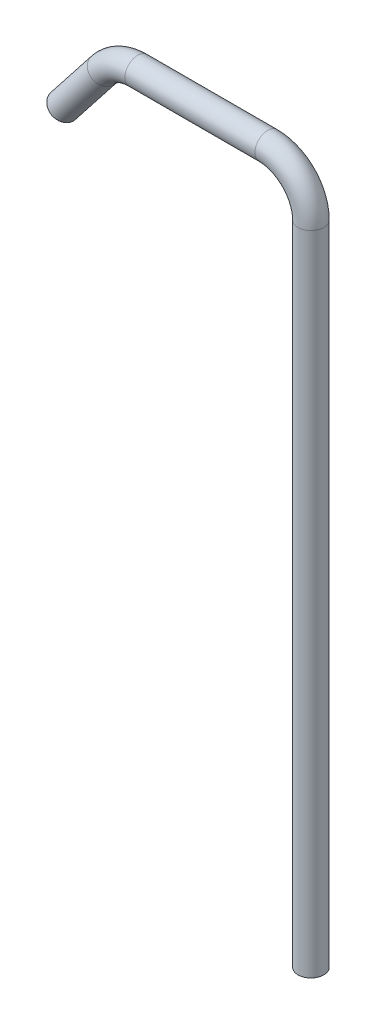
ISO-10303-21;
HEADER;
FILE_DESCRIPTION(('STEP AP214'),'2;1');
FILE_NAME('part.step','',(''),(''),'','','');
FILE_SCHEMA(('AUTOMOTIVE_DESIGN { 1 0 10303 214 1 1 1 1 }'));
ENDSEC;
DATA;
#1=APPLICATION_CONTEXT('core data for automotive mechanical design processes');
#2=APPLICATION_PROTOCOL_DEFINITION('international standard','automotive_design',2000,#1);
#3=PRODUCT_CONTEXT('',#1,'mechanical');
#4=PRODUCT('Part','Part','',(#3));
#5=PRODUCT_RELATED_PRODUCT_CATEGORY('part','',(#4));
#6=PRODUCT_DEFINITION_FORMATION('','',#4);
#7=PRODUCT_DEFINITION_CONTEXT('part definition',#1,'design');
#8=PRODUCT_DEFINITION('design','',#6,#7);
#9=PRODUCT_DEFINITION_SHAPE('','',#8);
#10=(LENGTH_UNIT() NAMED_UNIT(*) SI_UNIT(.MILLI.,.METRE.));
#11=(NAMED_UNIT(*) PLANE_ANGLE_UNIT() SI_UNIT($,.RADIAN.));
#12=(NAMED_UNIT(*) SI_UNIT($,.STERADIAN.) SOLID_ANGLE_UNIT());
#13=UNCERTAINTY_MEASURE_WITH_UNIT(LENGTH_MEASURE(1.E-05),#10,'distance_accuracy_value','');
#14=(GEOMETRIC_REPRESENTATION_CONTEXT(3) GLOBAL_UNCERTAINTY_ASSIGNED_CONTEXT((#13)) GLOBAL_UNIT_ASSIGNED_CONTEXT((#10,
#11,#12)) REPRESENTATION_CONTEXT('',''));
#15=CARTESIAN_POINT('',(0.,0.,0.));
#16=DIRECTION('',(0.,0.,1.));
#17=DIRECTION('',(1.,0.,0.));
#18=AXIS2_PLACEMENT_3D('',#15,#16,#17);
#19=CARTESIAN_POINT('',(-57.4055239128661,94.2016080561814,0.));
#20=DIRECTION('',(-0.617590719401513,-0.786499652453275,0.));
#21=DIRECTION('',(0.,0.,1.));
#22=AXIS2_PLACEMENT_3D('',#19,#20,#21);
#23=PLANE('',#22);
#24=CARTESIAN_POINT('',(-57.4055239128661,94.2016080561814,0.));
#25=DIRECTION('',(-0.617590719401513,-0.786499652453275,0.));
#26=DIRECTION('',(0.,0.,1.));
#27=AXIS2_PLACEMENT_3D('',#24,#25,#26);
#28=CIRCLE('',#27,3.);
#29=CARTESIAN_POINT('',(-57.4055239128661,94.2016080561814,3.));
#30=VERTEX_POINT('',#29);
#31=EDGE_CURVE('E11',#30,#30,#28,.T.);
#32=ORIENTED_EDGE('',*,*,#31,.T.);
#33=EDGE_LOOP('',(#32));
#34=FACE_BOUND('',#33,.T.);
#35=ADVANCED_FACE('F33',(#34),#23,.T.);
#36=CARTESIAN_POINT('',(0.,0.,0.));
#37=DIRECTION('',(0.,1.,0.));
#38=DIRECTION('',(0.,0.,1.));
#39=AXIS2_PLACEMENT_3D('',#36,#37,#38);
#40=CYLINDRICAL_SURFACE('',#39,3.);
#41=CARTESIAN_POINT('',(0.,99.9999999999999,0.));
#42=DIRECTION('',(0.,1.,0.));
#43=DIRECTION('',(0.,0.,1.));
#44=AXIS2_PLACEMENT_3D('',#41,#42,#43);
#45=CIRCLE('',#44,3.);
#46=CARTESIAN_POINT('',(3.,99.9999999999999,0.));
#47=VERTEX_POINT('',#46);
#48=EDGE_CURVE('E58',#47,#47,#45,.T.);
#49=ORIENTED_EDGE('',*,*,#48,.F.);
#50=EDGE_LOOP('',(#49));
#51=FACE_BOUND('',#50,.T.);
#52=CARTESIAN_POINT('',(0.,-50.,0.));
#53=DIRECTION('',(0.,-1.,0.));
#54=DIRECTION('',(0.,0.,-1.));
#55=AXIS2_PLACEMENT_3D('',#52,#53,#54);
#56=CIRCLE('',#55,3.);
#57=CARTESIAN_POINT('',(0.,-50.,-3.));
#58=VERTEX_POINT('',#57);
#59=EDGE_CURVE('E61',#58,#58,#56,.T.);
#60=ORIENTED_EDGE('',*,*,#59,.F.);
#61=EDGE_LOOP('',(#60));
#62=FACE_BOUND('',#61,.T.);
#63=ADVANCED_FACE('F66',(#51,#62),#40,.T.);
#64=CARTESIAN_POINT('',(-10.,100.,0.));
#65=DIRECTION('',(0.,0.,1.));
#66=DIRECTION('',(1.,0.,0.));
#67=AXIS2_PLACEMENT_3D('',#64,#65,#66);
#68=TOROIDAL_SURFACE('',#67,10.,3.);
#69=CARTESIAN_POINT('',(-10.0000000000001,110.,0.));
#70=DIRECTION('',(-1.,0.,0.));
#71=DIRECTION('',(0.,0.,1.));
#72=AXIS2_PLACEMENT_3D('',#69,#70,#71);
#73=CIRCLE('',#72,3.);
#74=CARTESIAN_POINT('',(-10.0000000000001,113.,0.));
#75=VERTEX_POINT('',#74);
#76=EDGE_CURVE('E53',#75,#75,#73,.T.);
#77=CARTESIAN_POINT('',(-10.,100.,0.));
#78=DIRECTION('',(0.,0.,1.));
#79=DIRECTION('',(1.,0.,0.));
#80=AXIS2_PLACEMENT_3D('',#77,#78,#79);
#81=CIRCLE('',#80,13.);
#82=EDGE_CURVE('',#47,#75,#81,.T.);
#83=ORIENTED_EDGE('',*,*,#48,.T.);
#84=ORIENTED_EDGE('',*,*,#76,.F.);
#85=ORIENTED_EDGE('',*,*,#82,.T.);
#86=ORIENTED_EDGE('',*,*,#82,.F.);
#87=EDGE_LOOP('',(#83,#85,#84,#86));
#88=FACE_BOUND('',#87,.T.);
#89=ADVANCED_FACE('F68',(#88),#68,.T.);
#90=CARTESIAN_POINT('',(-10.0000000000001,110.,0.));
#91=DIRECTION('',(-1.,0.,0.));
#92=DIRECTION('',(0.,0.,1.));
#93=AXIS2_PLACEMENT_3D('',#90,#91,#92);
#94=CYLINDRICAL_SURFACE('',#93,3.);
#95=CARTESIAN_POINT('',(-40.1378328088809,110.,0.));
#96=DIRECTION('',(-1.,0.,0.));
#97=DIRECTION('',(0.,0.,1.));
#98=AXIS2_PLACEMENT_3D('',#95,#96,#97);
#99=CIRCLE('',#98,3.);
#100=CARTESIAN_POINT('',(-40.1378328088809,113.,0.));
#101=VERTEX_POINT('',#100);
#102=EDGE_CURVE('E51',#101,#101,#99,.T.);
#103=ORIENTED_EDGE('',*,*,#102,.F.);
#104=EDGE_LOOP('',(#103));
#105=FACE_BOUND('',#104,.T.);
#106=ORIENTED_EDGE('',*,*,#76,.T.);
#107=EDGE_LOOP('',(#106));
#108=FACE_BOUND('',#107,.T.);
#109=ADVANCED_FACE('F75',(#105,#108),#94,.T.);
#110=CARTESIAN_POINT('',(-40.1378328088809,100.,0.));
#111=DIRECTION('',(0.,0.,1.));
#112=DIRECTION('',(1.,0.,0.));
#113=AXIS2_PLACEMENT_3D('',#110,#111,#112);
#114=TOROIDAL_SURFACE('',#113,9.99999999999999,3.);
#115=CARTESIAN_POINT('',(-48.0028293334137,106.175907194015,0.));
#116=DIRECTION('',(-0.617590719401509,-0.786499652453277,0.));
#117=DIRECTION('',(0.,0.,1.));
#118=AXIS2_PLACEMENT_3D('',#115,#116,#117);
#119=CIRCLE('',#118,3.);
#120=CARTESIAN_POINT('',(-50.3623282907735,108.02867935222,0.));
#121=VERTEX_POINT('',#120);
#122=EDGE_CURVE('E39',#121,#121,#119,.T.);
#123=CARTESIAN_POINT('',(-40.1378328088809,100.,0.));
#124=DIRECTION('',(0.,0.,1.));
#125=DIRECTION('',(1.,0.,0.));
#126=AXIS2_PLACEMENT_3D('',#123,#124,#125);
#127=CIRCLE('',#126,13.);
#128=EDGE_CURVE('',#101,#121,#127,.T.);
#129=ORIENTED_EDGE('',*,*,#102,.T.);
#130=ORIENTED_EDGE('',*,*,#122,.F.);
#131=ORIENTED_EDGE('',*,*,#128,.T.);
#132=ORIENTED_EDGE('',*,*,#128,.F.);
#133=EDGE_LOOP('',(#129,#131,#130,#132));
#134=FACE_BOUND('',#133,.T.);
#135=ADVANCED_FACE('F47',(#134),#114,.T.);
#136=CARTESIAN_POINT('',(-48.0028293334137,106.175907194015,0.));
#137=DIRECTION('',(-0.617590719401513,-0.786499652453275,0.));
#138=DIRECTION('',(0.786499652453275,-0.617590719401513,0.));
#139=AXIS2_PLACEMENT_3D('',#136,#137,#138);
#140=CYLINDRICAL_SURFACE('',#139,3.);
#141=ORIENTED_EDGE('',*,*,#31,.F.);
#142=EDGE_LOOP('',(#141));
#143=FACE_BOUND('',#142,.T.);
#144=ORIENTED_EDGE('',*,*,#122,.T.);
#145=EDGE_LOOP('',(#144));
#146=FACE_BOUND('',#145,.T.);
#147=ADVANCED_FACE('F43',(#143,#146),#140,.T.);
#148=CARTESIAN_POINT('',(0.,-50.,0.));
#149=DIRECTION('',(0.,-1.,0.));
#150=DIRECTION('',(0.,0.,-1.));
#151=AXIS2_PLACEMENT_3D('',#148,#149,#150);
#152=PLANE('',#151);
#153=ORIENTED_EDGE('',*,*,#59,.T.);
#154=EDGE_LOOP('',(#153));
#155=FACE_BOUND('',#154,.T.);
#156=ADVANCED_FACE('F46',(#155),#152,.T.);
#157=CLOSED_SHELL('',(#35,#63,#89,#109,#135,#147,#156));
#158=MANIFOLD_SOLID_BREP('B2',#157);
#159=ADVANCED_BREP_SHAPE_REPRESENTATION('',(#18,#158),#14);
#160=SHAPE_DEFINITION_REPRESENTATION(#9,#159);
ENDSEC;
END-ISO-10303-21;
